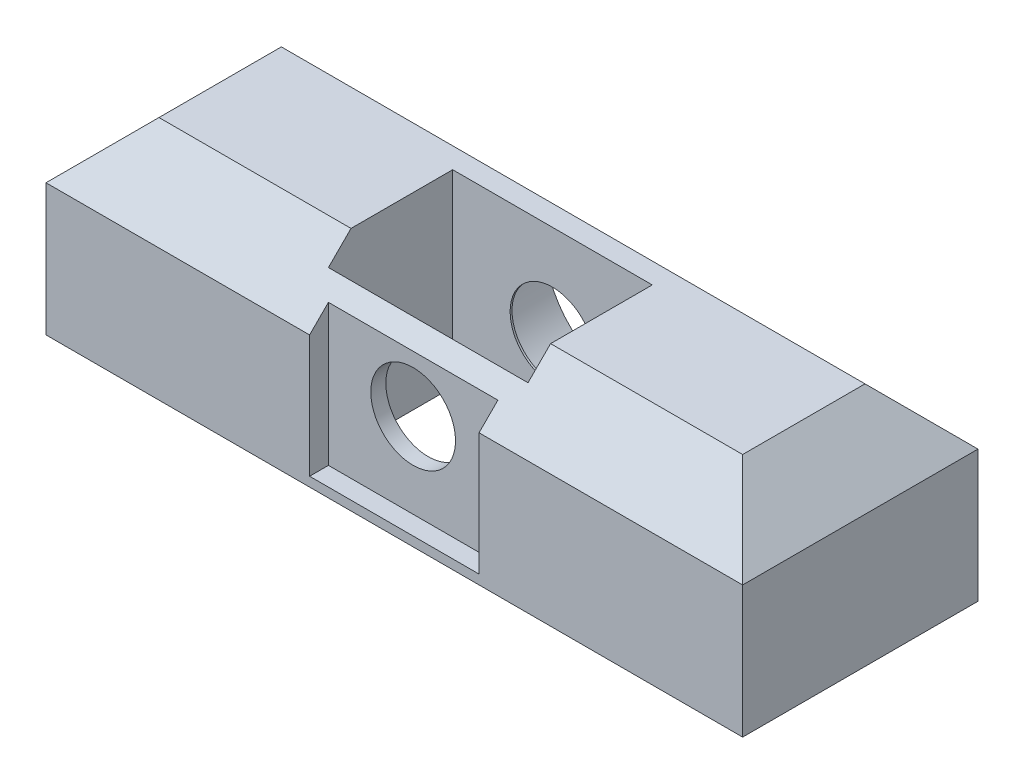
ISO-10303-21;
HEADER;
FILE_DESCRIPTION(('STEP AP214'),'2;1');
FILE_NAME('part.step','',(''),(''),'','','');
FILE_SCHEMA(('AUTOMOTIVE_DESIGN { 1 0 10303 214 1 1 1 1 }'));
ENDSEC;
DATA;
#1=APPLICATION_CONTEXT('core data for automotive mechanical design processes');
#2=APPLICATION_PROTOCOL_DEFINITION('international standard','automotive_design',2000,#1);
#3=PRODUCT_CONTEXT('',#1,'mechanical');
#4=PRODUCT('Part','Part','',(#3));
#5=PRODUCT_RELATED_PRODUCT_CATEGORY('part','',(#4));
#6=PRODUCT_DEFINITION_FORMATION('','',#4);
#7=PRODUCT_DEFINITION_CONTEXT('part definition',#1,'design');
#8=PRODUCT_DEFINITION('design','',#6,#7);
#9=PRODUCT_DEFINITION_SHAPE('','',#8);
#10=(LENGTH_UNIT() NAMED_UNIT(*) SI_UNIT(.MILLI.,.METRE.));
#11=(NAMED_UNIT(*) PLANE_ANGLE_UNIT() SI_UNIT($,.RADIAN.));
#12=(NAMED_UNIT(*) SI_UNIT($,.STERADIAN.) SOLID_ANGLE_UNIT());
#13=UNCERTAINTY_MEASURE_WITH_UNIT(LENGTH_MEASURE(1.E-05),#10,'distance_accuracy_value','');
#14=(GEOMETRIC_REPRESENTATION_CONTEXT(3) GLOBAL_UNCERTAINTY_ASSIGNED_CONTEXT((#13)) GLOBAL_UNIT_ASSIGNED_CONTEXT((#10,
#11,#12)) REPRESENTATION_CONTEXT('',''));
#15=CARTESIAN_POINT('',(0.,0.,0.));
#16=DIRECTION('',(0.,0.,1.));
#17=DIRECTION('',(1.,0.,0.));
#18=AXIS2_PLACEMENT_3D('',#15,#16,#17);
#19=CARTESIAN_POINT('',(0.,0.,12.5));
#20=DIRECTION('',(0.,0.,-1.));
#21=DIRECTION('',(-1.,0.,0.));
#22=AXIS2_PLACEMENT_3D('',#19,#20,#21);
#23=CYLINDRICAL_SURFACE('',#22,2.25);
#24=CARTESIAN_POINT('',(0.,0.,10.7));
#25=DIRECTION('',(0.,0.,1.));
#26=DIRECTION('',(1.,0.,0.));
#27=AXIS2_PLACEMENT_3D('',#24,#25,#26);
#28=CIRCLE('',#27,2.25);
#29=CARTESIAN_POINT('',(-2.25,0.,10.7));
#30=VERTEX_POINT('',#29);
#31=EDGE_CURVE('E200',#30,#30,#28,.T.);
#32=CARTESIAN_POINT('',(0.,0.,11.5));
#33=DIRECTION('',(0.,0.,1.));
#34=DIRECTION('',(1.,0.,0.));
#35=AXIS2_PLACEMENT_3D('',#32,#33,#34);
#36=CIRCLE('',#35,2.25);
#37=CARTESIAN_POINT('',(-2.25,0.,11.5));
#38=VERTEX_POINT('',#37);
#39=EDGE_CURVE('E242',#38,#38,#36,.T.);
#40=CARTESIAN_POINT('',(-2.25,0.,10.7));
#41=CARTESIAN_POINT('',(-2.25,0.,10.7083333333333));
#42=CARTESIAN_POINT('',(-2.25,0.,10.7166666666667));
#43=CARTESIAN_POINT('',(-2.25,0.,10.7333333333333));
#44=CARTESIAN_POINT('',(-2.25,0.,10.7416666666667));
#45=CARTESIAN_POINT('',(-2.25,0.,10.7583333333333));
#46=CARTESIAN_POINT('',(-2.25,0.,10.7666666666667));
#47=CARTESIAN_POINT('',(-2.25,0.,10.7833333333333));
#48=CARTESIAN_POINT('',(-2.25,0.,10.7916666666667));
#49=CARTESIAN_POINT('',(-2.25,0.,10.8083333333333));
#50=CARTESIAN_POINT('',(-2.25,0.,10.8166666666667));
#51=CARTESIAN_POINT('',(-2.25,0.,10.8333333333333));
#52=CARTESIAN_POINT('',(-2.25,0.,10.8416666666667));
#53=CARTESIAN_POINT('',(-2.25,0.,10.8583333333333));
#54=CARTESIAN_POINT('',(-2.25,0.,10.8666666666667));
#55=CARTESIAN_POINT('',(-2.25,0.,10.8833333333333));
#56=CARTESIAN_POINT('',(-2.25,0.,10.8916666666667));
#57=CARTESIAN_POINT('',(-2.25,0.,10.9083333333333));
#58=CARTESIAN_POINT('',(-2.25,0.,10.9166666666667));
#59=CARTESIAN_POINT('',(-2.25,0.,10.9333333333333));
#60=CARTESIAN_POINT('',(-2.25,0.,10.9416666666667));
#61=CARTESIAN_POINT('',(-2.25,0.,10.9583333333333));
#62=CARTESIAN_POINT('',(-2.25,0.,10.9666666666667));
#63=CARTESIAN_POINT('',(-2.25,0.,10.9833333333333));
#64=CARTESIAN_POINT('',(-2.25,0.,10.9916666666667));
#65=CARTESIAN_POINT('',(-2.25,0.,11.0083333333333));
#66=CARTESIAN_POINT('',(-2.25,0.,11.0166666666667));
#67=CARTESIAN_POINT('',(-2.25,0.,11.0333333333333));
#68=CARTESIAN_POINT('',(-2.25,0.,11.0416666666667));
#69=CARTESIAN_POINT('',(-2.25,0.,11.0583333333333));
#70=CARTESIAN_POINT('',(-2.25,0.,11.0666666666667));
#71=CARTESIAN_POINT('',(-2.25,0.,11.0833333333333));
#72=CARTESIAN_POINT('',(-2.25,0.,11.0916666666667));
#73=CARTESIAN_POINT('',(-2.25,0.,11.1083333333333));
#74=CARTESIAN_POINT('',(-2.25,0.,11.1166666666667));
#75=CARTESIAN_POINT('',(-2.25,0.,11.1333333333333));
#76=CARTESIAN_POINT('',(-2.25,0.,11.1416666666667));
#77=CARTESIAN_POINT('',(-2.25,0.,11.1583333333333));
#78=CARTESIAN_POINT('',(-2.25,0.,11.1666666666667));
#79=CARTESIAN_POINT('',(-2.25,0.,11.1833333333333));
#80=CARTESIAN_POINT('',(-2.25,0.,11.1916666666667));
#81=CARTESIAN_POINT('',(-2.25,0.,11.2083333333333));
#82=CARTESIAN_POINT('',(-2.25,0.,11.2166666666667));
#83=CARTESIAN_POINT('',(-2.25,0.,11.2333333333333));
#84=CARTESIAN_POINT('',(-2.25,0.,11.2416666666667));
#85=CARTESIAN_POINT('',(-2.25,0.,11.2583333333333));
#86=CARTESIAN_POINT('',(-2.25,0.,11.2666666666667));
#87=CARTESIAN_POINT('',(-2.25,0.,11.2833333333333));
#88=CARTESIAN_POINT('',(-2.25,0.,11.2916666666667));
#89=CARTESIAN_POINT('',(-2.25,0.,11.3083333333333));
#90=CARTESIAN_POINT('',(-2.25,0.,11.3166666666667));
#91=CARTESIAN_POINT('',(-2.25,0.,11.3333333333333));
#92=CARTESIAN_POINT('',(-2.25,0.,11.3416666666667));
#93=CARTESIAN_POINT('',(-2.25,0.,11.3583333333333));
#94=CARTESIAN_POINT('',(-2.25,0.,11.3666666666667));
#95=CARTESIAN_POINT('',(-2.25,0.,11.3833333333333));
#96=CARTESIAN_POINT('',(-2.25,0.,11.3916666666667));
#97=CARTESIAN_POINT('',(-2.25,0.,11.4083333333333));
#98=CARTESIAN_POINT('',(-2.25,0.,11.4166666666667));
#99=CARTESIAN_POINT('',(-2.25,0.,11.4333333333333));
#100=CARTESIAN_POINT('',(-2.25,0.,11.4416666666667));
#101=CARTESIAN_POINT('',(-2.25,0.,11.4583333333333));
#102=CARTESIAN_POINT('',(-2.25,0.,11.4666666666667));
#103=CARTESIAN_POINT('',(-2.25,0.,11.4833333333333));
#104=CARTESIAN_POINT('',(-2.25,0.,11.4916666666667));
#105=CARTESIAN_POINT('',(-2.25,0.,11.5));
#106=B_SPLINE_CURVE_WITH_KNOTS('',3,(#40,#41,#42,#43,#44,#45,#46,#47,#48,#49,#50,#51,#52,#53,
#54,#55,#56,#57,#58,#59,#60,#61,#62,#63,#64,#65,#66,#67,#68,#69,#70,#71,#72,#73,#74,#75,#76,#77,
#78,#79,#80,#81,#82,#83,#84,#85,#86,#87,#88,#89,#90,#91,#92,#93,#94,#95,#96,#97,#98,#99,#100,
#101,#102,#103,#104,#105),.UNSPECIFIED.,.F.,.F.,(4,2,2,2,2,2,2,2,2,2,2,2,2,2,2,2,2,2,2,2,2,2,2,
2,2,2,2,2,2,2,2,2,4),(0.,0.024999999999999,0.0499999999999997,0.0749999999999987,
0.0999999999999994,0.125,0.149999999999999,0.175,0.199999999999999,0.225,0.249999999999999,
0.274999999999999,0.3,0.324999999999999,0.35,0.374999999999999,0.399999999999999,0.425,
0.449999999999999,0.475,0.499999999999999,0.524999999999999,0.55,0.574999999999999,0.6,
0.624999999999999,0.65,0.674999999999998,0.699999999999999,0.725,0.749999999999999,0.775,
0.799999999999999),.UNSPECIFIED.);
#107=EDGE_CURVE('BSEAM47',#30,#38,#106,.T.);
#108=ORIENTED_EDGE('',*,*,#31,.F.);
#109=ORIENTED_EDGE('',*,*,#39,.T.);
#110=ORIENTED_EDGE('',*,*,#107,.T.);
#111=ORIENTED_EDGE('',*,*,#107,.F.);
#112=EDGE_LOOP('',(#108,#110,#109,#111));
#113=FACE_BOUND('',#112,.T.);
#114=ADVANCED_FACE('F47',(#113),#23,.F.);
#115=CARTESIAN_POINT('',(0.,0.,4.1));
#116=DIRECTION('',(0.,0.,-1.));
#117=DIRECTION('',(-1.,0.,0.));
#118=AXIS2_PLACEMENT_3D('',#115,#116,#117);
#119=CIRCLE('',#118,2.25);
#120=CARTESIAN_POINT('',(-2.25,0.,4.1));
#121=VERTEX_POINT('',#120);
#122=EDGE_CURVE('E210',#121,#121,#119,.T.);
#123=CARTESIAN_POINT('',(0.,0.,4.));
#124=DIRECTION('',(0.,0.,-1.));
#125=DIRECTION('',(-1.,0.,0.));
#126=AXIS2_PLACEMENT_3D('',#123,#124,#125);
#127=CIRCLE('',#126,2.25);
#128=CARTESIAN_POINT('',(-2.25,0.,4.));
#129=VERTEX_POINT('',#128);
#130=EDGE_CURVE('E250',#129,#129,#127,.T.);
#131=CARTESIAN_POINT('',(-2.25,0.,4.1));
#132=CARTESIAN_POINT('',(-2.25,0.,4.09895833333334));
#133=CARTESIAN_POINT('',(-2.25,0.,4.09791666666667));
#134=CARTESIAN_POINT('',(-2.25,0.,4.09583333333334));
#135=CARTESIAN_POINT('',(-2.25,0.,4.09479166666667));
#136=CARTESIAN_POINT('',(-2.25,0.,4.09270833333334));
#137=CARTESIAN_POINT('',(-2.25,0.,4.09166666666667));
#138=CARTESIAN_POINT('',(-2.25,0.,4.08958333333334));
#139=CARTESIAN_POINT('',(-2.25,0.,4.08854166666667));
#140=CARTESIAN_POINT('',(-2.25,0.,4.08645833333334));
#141=CARTESIAN_POINT('',(-2.25,0.,4.08541666666667));
#142=CARTESIAN_POINT('',(-2.25,0.,4.08333333333334));
#143=CARTESIAN_POINT('',(-2.25,0.,4.08229166666667));
#144=CARTESIAN_POINT('',(-2.25,0.,4.08020833333333));
#145=CARTESIAN_POINT('',(-2.25,0.,4.07916666666667));
#146=CARTESIAN_POINT('',(-2.25,0.,4.07708333333334));
#147=CARTESIAN_POINT('',(-2.25,0.,4.07604166666667));
#148=CARTESIAN_POINT('',(-2.25,0.,4.07395833333334));
#149=CARTESIAN_POINT('',(-2.25,0.,4.07291666666667));
#150=CARTESIAN_POINT('',(-2.25,0.,4.07083333333334));
#151=CARTESIAN_POINT('',(-2.25,0.,4.06979166666667));
#152=CARTESIAN_POINT('',(-2.25,0.,4.06770833333334));
#153=CARTESIAN_POINT('',(-2.25,0.,4.06666666666667));
#154=CARTESIAN_POINT('',(-2.25,0.,4.06458333333333));
#155=CARTESIAN_POINT('',(-2.25,0.,4.06354166666667));
#156=CARTESIAN_POINT('',(-2.25,0.,4.06145833333334));
#157=CARTESIAN_POINT('',(-2.25,0.,4.06041666666667));
#158=CARTESIAN_POINT('',(-2.25,0.,4.05833333333333));
#159=CARTESIAN_POINT('',(-2.25,0.,4.05729166666667));
#160=CARTESIAN_POINT('',(-2.25,0.,4.05520833333333));
#161=CARTESIAN_POINT('',(-2.25,0.,4.05416666666667));
#162=CARTESIAN_POINT('',(-2.25,0.,4.05208333333333));
#163=CARTESIAN_POINT('',(-2.25,0.,4.05104166666667));
#164=CARTESIAN_POINT('',(-2.25,0.,4.04895833333333));
#165=CARTESIAN_POINT('',(-2.25,0.,4.04791666666667));
#166=CARTESIAN_POINT('',(-2.25,0.,4.04583333333334));
#167=CARTESIAN_POINT('',(-2.25,0.,4.04479166666667));
#168=CARTESIAN_POINT('',(-2.25,0.,4.04270833333333));
#169=CARTESIAN_POINT('',(-2.25,0.,4.04166666666667));
#170=CARTESIAN_POINT('',(-2.25,0.,4.03958333333333));
#171=CARTESIAN_POINT('',(-2.25,0.,4.03854166666667));
#172=CARTESIAN_POINT('',(-2.25,0.,4.03645833333333));
#173=CARTESIAN_POINT('',(-2.25,0.,4.03541666666667));
#174=CARTESIAN_POINT('',(-2.25,0.,4.03333333333333));
#175=CARTESIAN_POINT('',(-2.25,0.,4.03229166666667));
#176=CARTESIAN_POINT('',(-2.25,0.,4.03020833333333));
#177=CARTESIAN_POINT('',(-2.25,0.,4.02916666666667));
#178=CARTESIAN_POINT('',(-2.25,0.,4.02708333333333));
#179=CARTESIAN_POINT('',(-2.25,0.,4.02604166666667));
#180=CARTESIAN_POINT('',(-2.25,0.,4.02395833333333));
#181=CARTESIAN_POINT('',(-2.25,0.,4.02291666666667));
#182=CARTESIAN_POINT('',(-2.25,0.,4.02083333333333));
#183=CARTESIAN_POINT('',(-2.25,0.,4.01979166666667));
#184=CARTESIAN_POINT('',(-2.25,0.,4.01770833333333));
#185=CARTESIAN_POINT('',(-2.25,0.,4.01666666666667));
#186=CARTESIAN_POINT('',(-2.25,0.,4.01458333333333));
#187=CARTESIAN_POINT('',(-2.25,0.,4.01354166666667));
#188=CARTESIAN_POINT('',(-2.25,0.,4.01145833333333));
#189=CARTESIAN_POINT('',(-2.25,0.,4.01041666666667));
#190=CARTESIAN_POINT('',(-2.25,0.,4.00833333333333));
#191=CARTESIAN_POINT('',(-2.25,0.,4.00729166666667));
#192=CARTESIAN_POINT('',(-2.25,0.,4.00520833333333));
#193=CARTESIAN_POINT('',(-2.25,0.,4.00416666666667));
#194=CARTESIAN_POINT('',(-2.25,0.,4.00208333333333));
#195=CARTESIAN_POINT('',(-2.25,0.,4.00104166666667));
#196=CARTESIAN_POINT('',(-2.25,0.,4.));
#197=B_SPLINE_CURVE_WITH_KNOTS('',3,(#131,#132,#133,#134,#135,#136,#137,#138,#139,#140,#141,
#142,#143,#144,#145,#146,#147,#148,#149,#150,#151,#152,#153,#154,#155,#156,#157,#158,#159,#160,
#161,#162,#163,#164,#165,#166,#167,#168,#169,#170,#171,#172,#173,#174,#175,#176,#177,#178,#179,
#180,#181,#182,#183,#184,#185,#186,#187,#188,#189,#190,#191,#192,#193,#194,#195,#196),
.UNSPECIFIED.,.F.,.F.,(4,2,2,2,2,2,2,2,2,2,2,2,2,2,2,2,2,2,2,2,2,2,2,2,2,2,2,2,2,2,2,2,4),(0.,
0.00312499999999966,0.00624999999999931,0.0093750000000007,0.0125000000000004,0.015625,
0.0187500000000014,0.0218750000000011,0.0250000000000007,0.0281250000000004,0.03125,
0.0343750000000014,0.0375000000000011,0.0406250000000007,0.0437500000000021,0.0468750000000018,
0.0500000000000014,0.0531250000000011,0.0562500000000007,0.0593750000000021,0.0625000000000018,
0.0656250000000014,0.0687500000000028,0.0718750000000025,0.0750000000000021,0.0781250000000018,
0.0812500000000015,0.0843750000000029,0.0875000000000025,0.0906250000000022,0.0937500000000036,
0.0968750000000032,0.100000000000003),.UNSPECIFIED.);
#198=EDGE_CURVE('BSEAM407',#121,#129,#197,.T.);
#199=ORIENTED_EDGE('',*,*,#122,.F.);
#200=ORIENTED_EDGE('',*,*,#130,.T.);
#201=ORIENTED_EDGE('',*,*,#198,.T.);
#202=ORIENTED_EDGE('',*,*,#198,.F.);
#203=EDGE_LOOP('',(#199,#201,#200,#202));
#204=FACE_BOUND('',#203,.T.);
#205=ADVANCED_FACE('F407',(#204),#23,.F.);
#206=CARTESIAN_POINT('',(18.5,5.,4.5));
#207=DIRECTION('',(-1.,0.,0.));
#208=DIRECTION('',(0.,-1.,0.));
#209=AXIS2_PLACEMENT_3D('',#206,#207,#208);
#210=PLANE('',#209);
#211=DIRECTION('',(0.,1.,0.));
#212=VECTOR('',#211,1.);
#213=CARTESIAN_POINT('',(18.5,5.,0.));
#214=LINE('',#213,#212);
#215=CARTESIAN_POINT('',(18.5,-5.,0.));
#216=VERTEX_POINT('',#215);
#217=CARTESIAN_POINT('',(18.5,1.99999999999995,0.));
#218=VERTEX_POINT('',#217);
#219=EDGE_CURVE('E266',#216,#218,#214,.T.);
#220=ORIENTED_EDGE('',*,*,#219,.T.);
#221=DIRECTION('',(0.,0.,1.));
#222=VECTOR('',#221,1.);
#223=CARTESIAN_POINT('',(18.5,1.99999999999995,4.5));
#224=LINE('',#223,#222);
#225=CARTESIAN_POINT('',(18.5,1.99999999999995,12.5));
#226=VERTEX_POINT('',#225);
#227=EDGE_CURVE('E307',#218,#226,#224,.T.);
#228=ORIENTED_EDGE('',*,*,#227,.T.);
#229=DIRECTION('',(0.,1.,0.));
#230=VECTOR('',#229,1.);
#231=CARTESIAN_POINT('',(18.5,5.,12.5));
#232=LINE('',#231,#230);
#233=CARTESIAN_POINT('',(18.5,-4.99999999999999,12.5));
#234=VERTEX_POINT('',#233);
#235=EDGE_CURVE('E255',#234,#226,#232,.T.);
#236=ORIENTED_EDGE('',*,*,#235,.F.);
#237=DIRECTION('',(0.,0.,-1.));
#238=VECTOR('',#237,1.);
#239=CARTESIAN_POINT('',(18.5,-5.,4.5));
#240=LINE('',#239,#238);
#241=EDGE_CURVE('E276',#234,#216,#240,.T.);
#242=ORIENTED_EDGE('',*,*,#241,.T.);
#243=EDGE_LOOP('',(#220,#228,#236,#242));
#244=FACE_BOUND('',#243,.T.);
#245=ADVANCED_FACE('F412',(#244),#210,.F.);
#246=CARTESIAN_POINT('',(-18.5,5.,4.5));
#247=DIRECTION('',(0.,-1.,0.));
#248=DIRECTION('',(0.,0.,-1.));
#249=AXIS2_PLACEMENT_3D('',#246,#247,#248);
#250=PLANE('',#249);
#251=DIRECTION('',(1.,0.,0.));
#252=VECTOR('',#251,1.);
#253=CARTESIAN_POINT('',(-18.5,5.,9.49999999999998));
#254=LINE('',#253,#252);
#255=CARTESIAN_POINT('',(-15.5,5.,9.49999999999998));
#256=VERTEX_POINT('',#255);
#257=CARTESIAN_POINT('',(-5.3,5.,9.49999999999998));
#258=VERTEX_POINT('',#257);
#259=EDGE_CURVE('E303',#256,#258,#254,.T.);
#260=ORIENTED_EDGE('',*,*,#259,.T.);
#261=DIRECTION('',(0.,0.,1.));
#262=VECTOR('',#261,1.);
#263=CARTESIAN_POINT('',(-5.3,5.,4.1));
#264=LINE('',#263,#262);
#265=CARTESIAN_POINT('',(-5.3,5.,4.1));
#266=VERTEX_POINT('',#265);
#267=EDGE_CURVE('E192',#266,#258,#264,.T.);
#268=ORIENTED_EDGE('',*,*,#267,.F.);
#269=DIRECTION('',(-1.,0.,0.));
#270=VECTOR('',#269,1.);
#271=CARTESIAN_POINT('',(-5.3,5.,4.1));
#272=LINE('',#271,#270);
#273=CARTESIAN_POINT('',(5.3,5.,4.1));
#274=VERTEX_POINT('',#273);
#275=EDGE_CURVE('E181',#274,#266,#272,.T.);
#276=ORIENTED_EDGE('',*,*,#275,.F.);
#277=DIRECTION('',(0.,0.,-1.));
#278=VECTOR('',#277,1.);
#279=CARTESIAN_POINT('',(5.3,5.,4.1));
#280=LINE('',#279,#278);
#281=CARTESIAN_POINT('',(5.3,5.,9.49999999999998));
#282=VERTEX_POINT('',#281);
#283=EDGE_CURVE('E185',#282,#274,#280,.T.);
#284=ORIENTED_EDGE('',*,*,#283,.F.);
#285=DIRECTION('',(1.,0.,0.));
#286=VECTOR('',#285,1.);
#287=CARTESIAN_POINT('',(-18.5,5.,9.49999999999998));
#288=LINE('',#287,#286);
#289=CARTESIAN_POINT('',(15.5,5.,9.49999999999998));
#290=VERTEX_POINT('',#289);
#291=EDGE_CURVE('E284',#282,#290,#288,.T.);
#292=ORIENTED_EDGE('',*,*,#291,.T.);
#293=DIRECTION('',(0.,0.,-1.));
#294=VECTOR('',#293,1.);
#295=CARTESIAN_POINT('',(15.5,5.,4.5));
#296=LINE('',#295,#294);
#297=CARTESIAN_POINT('',(15.5,5.,3.00000000000002));
#298=VERTEX_POINT('',#297);
#299=EDGE_CURVE('E293',#290,#298,#296,.T.);
#300=ORIENTED_EDGE('',*,*,#299,.T.);
#301=DIRECTION('',(-1.,0.,0.));
#302=VECTOR('',#301,1.);
#303=CARTESIAN_POINT('',(-18.5,5.,3.00000000000002));
#304=LINE('',#303,#302);
#305=CARTESIAN_POINT('',(-15.5,5.,3.00000000000002));
#306=VERTEX_POINT('',#305);
#307=EDGE_CURVE('E297',#298,#306,#304,.T.);
#308=ORIENTED_EDGE('',*,*,#307,.T.);
#309=DIRECTION('',(0.,0.,1.));
#310=VECTOR('',#309,1.);
#311=CARTESIAN_POINT('',(-15.5,5.,4.5));
#312=LINE('',#311,#310);
#313=EDGE_CURVE('E300',#306,#256,#312,.T.);
#314=ORIENTED_EDGE('',*,*,#313,.T.);
#315=EDGE_LOOP('',(#260,#268,#276,#284,#292,#300,#308,#314));
#316=FACE_BOUND('',#315,.T.);
#317=ADVANCED_FACE('F360',(#316),#250,.F.);
#318=CARTESIAN_POINT('',(-18.5,5.,4.5));
#319=DIRECTION('',(1.,0.,0.));
#320=DIRECTION('',(0.,1.,0.));
#321=AXIS2_PLACEMENT_3D('',#318,#319,#320);
#322=PLANE('',#321);
#323=DIRECTION('',(0.,-1.,0.));
#324=VECTOR('',#323,1.);
#325=CARTESIAN_POINT('',(-18.5,5.,12.5));
#326=LINE('',#325,#324);
#327=CARTESIAN_POINT('',(-18.5,1.99999999999995,12.5));
#328=VERTEX_POINT('',#327);
#329=CARTESIAN_POINT('',(-18.5,-5.,12.5));
#330=VERTEX_POINT('',#329);
#331=EDGE_CURVE('E259',#328,#330,#326,.T.);
#332=ORIENTED_EDGE('',*,*,#331,.F.);
#333=DIRECTION('',(0.,0.,-1.));
#334=VECTOR('',#333,1.);
#335=CARTESIAN_POINT('',(-18.5,1.99999999999995,4.5));
#336=LINE('',#335,#334);
#337=CARTESIAN_POINT('',(-18.5,1.99999999999995,0.));
#338=VERTEX_POINT('',#337);
#339=EDGE_CURVE('E320',#328,#338,#336,.T.);
#340=ORIENTED_EDGE('',*,*,#339,.T.);
#341=DIRECTION('',(0.,-1.,0.));
#342=VECTOR('',#341,1.);
#343=CARTESIAN_POINT('',(-18.5,5.,0.));
#344=LINE('',#343,#342);
#345=CARTESIAN_POINT('',(-18.5,-5.,0.));
#346=VERTEX_POINT('',#345);
#347=EDGE_CURVE('E270',#338,#346,#344,.T.);
#348=ORIENTED_EDGE('',*,*,#347,.T.);
#349=DIRECTION('',(0.,0.,-1.));
#350=VECTOR('',#349,1.);
#351=CARTESIAN_POINT('',(-18.5,-5.,4.5));
#352=LINE('',#351,#350);
#353=EDGE_CURVE('E280',#330,#346,#352,.T.);
#354=ORIENTED_EDGE('',*,*,#353,.F.);
#355=EDGE_LOOP('',(#332,#340,#348,#354));
#356=FACE_BOUND('',#355,.T.);
#357=ADVANCED_FACE('F421',(#356),#322,.F.);
#358=CARTESIAN_POINT('',(-18.5,-5.,4.5));
#359=DIRECTION('',(0.,1.,0.));
#360=DIRECTION('',(0.,0.,1.));
#361=AXIS2_PLACEMENT_3D('',#358,#359,#360);
#362=PLANE('',#361);
#363=DIRECTION('',(-1.,0.,0.));
#364=VECTOR('',#363,1.);
#365=CARTESIAN_POINT('',(-5.3,-5.,4.1));
#366=LINE('',#365,#364);
#367=CARTESIAN_POINT('',(5.3,-5.,4.1));
#368=VERTEX_POINT('',#367);
#369=CARTESIAN_POINT('',(-5.3,-5.,4.1));
#370=VERTEX_POINT('',#369);
#371=EDGE_CURVE('E169',#368,#370,#366,.T.);
#372=ORIENTED_EDGE('',*,*,#371,.T.);
#373=DIRECTION('',(0.,0.,1.));
#374=VECTOR('',#373,1.);
#375=CARTESIAN_POINT('',(-5.3,-5.,4.1));
#376=LINE('',#375,#374);
#377=CARTESIAN_POINT('',(-5.3,-5.,10.7));
#378=VERTEX_POINT('',#377);
#379=EDGE_CURVE('E163',#370,#378,#376,.T.);
#380=ORIENTED_EDGE('',*,*,#379,.T.);
#381=DIRECTION('',(1.,0.,0.));
#382=VECTOR('',#381,1.);
#383=CARTESIAN_POINT('',(-5.3,-5.,10.7));
#384=LINE('',#383,#382);
#385=CARTESIAN_POINT('',(5.3,-5.,10.7));
#386=VERTEX_POINT('',#385);
#387=EDGE_CURVE('E172',#378,#386,#384,.T.);
#388=ORIENTED_EDGE('',*,*,#387,.T.);
#389=DIRECTION('',(0.,0.,-1.));
#390=VECTOR('',#389,1.);
#391=CARTESIAN_POINT('',(5.3,-5.,4.1));
#392=LINE('',#391,#390);
#393=EDGE_CURVE('E64',#386,#368,#392,.T.);
#394=ORIENTED_EDGE('',*,*,#393,.T.);
#395=EDGE_LOOP('',(#372,#380,#388,#394));
#396=FACE_BOUND('',#395,.T.);
#397=DIRECTION('',(1.,0.,0.));
#398=VECTOR('',#397,1.);
#399=CARTESIAN_POINT('',(18.5,-4.99999999999999,12.5));
#400=LINE('',#399,#398);
#401=EDGE_CURVE('E262',#330,#234,#400,.T.);
#402=ORIENTED_EDGE('',*,*,#401,.F.);
#403=ORIENTED_EDGE('',*,*,#353,.T.);
#404=DIRECTION('',(1.,0.,0.));
#405=VECTOR('',#404,1.);
#406=CARTESIAN_POINT('',(-18.5,-5.,0.));
#407=LINE('',#406,#405);
#408=EDGE_CURVE('E273',#346,#216,#407,.T.);
#409=ORIENTED_EDGE('',*,*,#408,.T.);
#410=ORIENTED_EDGE('',*,*,#241,.F.);
#411=EDGE_LOOP('',(#402,#403,#409,#410));
#412=FACE_BOUND('',#411,.T.);
#413=ADVANCED_FACE('F177',(#396,#412),#362,.F.);
#414=CARTESIAN_POINT('',(0.,0.,0.));
#415=DIRECTION('',(0.,0.,1.));
#416=DIRECTION('',(1.,0.,0.));
#417=AXIS2_PLACEMENT_3D('',#414,#415,#416);
#418=PLANE('',#417);
#419=ORIENTED_EDGE('',*,*,#347,.F.);
#420=DIRECTION('',(1.,0.,0.));
#421=VECTOR('',#420,1.);
#422=CARTESIAN_POINT('',(0.,1.99999999999995,0.));
#423=LINE('',#422,#421);
#424=CARTESIAN_POINT('',(-4.0311288741493,1.99999999999995,0.));
#425=VERTEX_POINT('',#424);
#426=EDGE_CURVE('E314',#338,#425,#423,.T.);
#427=ORIENTED_EDGE('',*,*,#426,.T.);
#428=CARTESIAN_POINT('',(0.,0.,0.));
#429=DIRECTION('',(0.,0.,-1.));
#430=DIRECTION('',(-1.,0.,0.));
#431=AXIS2_PLACEMENT_3D('',#428,#429,#430);
#432=CIRCLE('',#431,4.5);
#433=CARTESIAN_POINT('',(4.0311288741493,1.99999999999995,0.));
#434=VERTEX_POINT('',#433);
#435=EDGE_CURVE('E251',#434,#425,#432,.T.);
#436=ORIENTED_EDGE('',*,*,#435,.F.);
#437=DIRECTION('',(1.,0.,0.));
#438=VECTOR('',#437,1.);
#439=CARTESIAN_POINT('',(0.,1.99999999999995,0.));
#440=LINE('',#439,#438);
#441=EDGE_CURVE('E311',#434,#218,#440,.T.);
#442=ORIENTED_EDGE('',*,*,#441,.T.);
#443=ORIENTED_EDGE('',*,*,#219,.F.);
#444=ORIENTED_EDGE('',*,*,#408,.F.);
#445=EDGE_LOOP('',(#419,#427,#436,#442,#443,#444));
#446=FACE_BOUND('',#445,.T.);
#447=ADVANCED_FACE('F386',(#446),#418,.F.);
#448=CARTESIAN_POINT('',(0.,0.,12.5));
#449=DIRECTION('',(0.,0.,-1.));
#450=DIRECTION('',(-1.,0.,0.));
#451=AXIS2_PLACEMENT_3D('',#448,#449,#450);
#452=PLANE('',#451);
#453=ORIENTED_EDGE('',*,*,#235,.T.);
#454=DIRECTION('',(-1.,0.,0.));
#455=VECTOR('',#454,1.);
#456=CARTESIAN_POINT('',(0.,1.99999999999995,12.5));
#457=LINE('',#456,#455);
#458=CARTESIAN_POINT('',(4.5,1.99999999999995,12.5));
#459=VERTEX_POINT('',#458);
#460=EDGE_CURVE('E326',#226,#459,#457,.T.);
#461=ORIENTED_EDGE('',*,*,#460,.T.);
#462=DIRECTION('',(0.,1.,0.));
#463=VECTOR('',#462,1.);
#464=CARTESIAN_POINT('',(4.5,4.5,12.5));
#465=LINE('',#464,#463);
#466=CARTESIAN_POINT('',(4.5,-4.5,12.5));
#467=VERTEX_POINT('',#466);
#468=EDGE_CURVE('E228',#467,#459,#465,.T.);
#469=ORIENTED_EDGE('',*,*,#468,.F.);
#470=DIRECTION('',(1.,0.,0.));
#471=VECTOR('',#470,1.);
#472=CARTESIAN_POINT('',(-4.5,-4.5,12.5));
#473=LINE('',#472,#471);
#474=CARTESIAN_POINT('',(-4.5,-4.5,12.5));
#475=VERTEX_POINT('',#474);
#476=EDGE_CURVE('E220',#475,#467,#473,.T.);
#477=ORIENTED_EDGE('',*,*,#476,.F.);
#478=DIRECTION('',(0.,-1.,0.));
#479=VECTOR('',#478,1.);
#480=CARTESIAN_POINT('',(-4.5,4.5,12.5));
#481=LINE('',#480,#479);
#482=CARTESIAN_POINT('',(-4.5,1.99999999999995,12.5));
#483=VERTEX_POINT('',#482);
#484=EDGE_CURVE('E232',#483,#475,#481,.T.);
#485=ORIENTED_EDGE('',*,*,#484,.F.);
#486=DIRECTION('',(-1.,0.,0.));
#487=VECTOR('',#486,1.);
#488=CARTESIAN_POINT('',(0.,1.99999999999995,12.5));
#489=LINE('',#488,#487);
#490=EDGE_CURVE('E323',#483,#328,#489,.T.);
#491=ORIENTED_EDGE('',*,*,#490,.T.);
#492=ORIENTED_EDGE('',*,*,#331,.T.);
#493=ORIENTED_EDGE('',*,*,#401,.T.);
#494=EDGE_LOOP('',(#453,#461,#469,#477,#485,#491,#492,#493));
#495=FACE_BOUND('',#494,.T.);
#496=ADVANCED_FACE('F392',(#495),#452,.F.);
#497=CARTESIAN_POINT('',(0.,0.,4.));
#498=DIRECTION('',(0.,0.,-1.));
#499=DIRECTION('',(-1.,0.,0.));
#500=AXIS2_PLACEMENT_3D('',#497,#498,#499);
#501=CYLINDRICAL_SURFACE('',#500,4.5);
#502=CARTESIAN_POINT('',(0.,0.,4.));
#503=DIRECTION('',(0.,0.,-1.));
#504=DIRECTION('',(-1.,0.,0.));
#505=AXIS2_PLACEMENT_3D('',#502,#503,#504);
#506=CIRCLE('',#505,4.5);
#507=CARTESIAN_POINT('',(-4.5,0.,4.));
#508=VERTEX_POINT('',#507);
#509=EDGE_CURVE('E246',#508,#508,#506,.T.);
#510=ORIENTED_EDGE('',*,*,#509,.F.);
#511=EDGE_LOOP('',(#510));
#512=FACE_BOUND('',#511,.T.);
#513=ORIENTED_EDGE('',*,*,#435,.T.);
#514=CARTESIAN_POINT('',(0.,0.,-1.99999999999993));
#515=DIRECTION('',(0.,-0.707106781186544,0.707106781186551));
#516=DIRECTION('',(0.,-0.707106781186551,-0.707106781186544));
#517=AXIS2_PLACEMENT_3D('',#514,#515,#516);
#518=ELLIPSE('',#517,6.36396103067889,4.5);
#519=EDGE_CURVE('E317',#425,#434,#518,.F.);
#520=ORIENTED_EDGE('',*,*,#519,.T.);
#521=EDGE_LOOP('',(#513,#520));
#522=FACE_BOUND('',#521,.T.);
#523=ADVANCED_FACE('F389',(#512,#522),#501,.F.);
#524=CARTESIAN_POINT('',(0.,0.,4.));
#525=DIRECTION('',(0.,0.,-1.));
#526=DIRECTION('',(-1.,0.,0.));
#527=AXIS2_PLACEMENT_3D('',#524,#525,#526);
#528=PLANE('',#527);
#529=ORIENTED_EDGE('',*,*,#130,.F.);
#530=EDGE_LOOP('',(#529));
#531=FACE_BOUND('',#530,.T.);
#532=ORIENTED_EDGE('',*,*,#509,.T.);
#533=EDGE_LOOP('',(#532));
#534=FACE_BOUND('',#533,.T.);
#535=ADVANCED_FACE('F391',(#531,#534),#528,.T.);
#536=CARTESIAN_POINT('',(4.5,4.5,11.5));
#537=DIRECTION('',(1.,0.,0.));
#538=DIRECTION('',(0.,0.,-1.));
#539=AXIS2_PLACEMENT_3D('',#536,#537,#538);
#540=PLANE('',#539);
#541=ORIENTED_EDGE('',*,*,#468,.T.);
#542=DIRECTION('',(0.,-0.707106781186551,0.707106781186544));
#543=VECTOR('',#542,1.);
#544=CARTESIAN_POINT('',(4.5,1.99999999999995,12.5));
#545=LINE('',#544,#543);
#546=CARTESIAN_POINT('',(4.5,2.99999999999996,11.5));
#547=VERTEX_POINT('',#546);
#548=EDGE_CURVE('E329',#459,#547,#545,.F.);
#549=ORIENTED_EDGE('',*,*,#548,.T.);
#550=DIRECTION('',(0.,1.,0.));
#551=VECTOR('',#550,1.);
#552=CARTESIAN_POINT('',(4.5,4.5,11.5));
#553=LINE('',#552,#551);
#554=CARTESIAN_POINT('',(4.5,-4.5,11.5));
#555=VERTEX_POINT('',#554);
#556=EDGE_CURVE('E215',#555,#547,#553,.T.);
#557=ORIENTED_EDGE('',*,*,#556,.F.);
#558=DIRECTION('',(0.,0.,1.));
#559=VECTOR('',#558,1.);
#560=CARTESIAN_POINT('',(4.5,-4.5,11.5));
#561=LINE('',#560,#559);
#562=EDGE_CURVE('E239',#555,#467,#561,.T.);
#563=ORIENTED_EDGE('',*,*,#562,.T.);
#564=EDGE_LOOP('',(#541,#549,#557,#563));
#565=FACE_BOUND('',#564,.T.);
#566=ADVANCED_FACE('F399',(#565),#540,.F.);
#567=CARTESIAN_POINT('',(-4.5,-4.5,11.5));
#568=DIRECTION('',(0.,-1.,0.));
#569=DIRECTION('',(0.,0.,-1.));
#570=AXIS2_PLACEMENT_3D('',#567,#568,#569);
#571=PLANE('',#570);
#572=ORIENTED_EDGE('',*,*,#476,.T.);
#573=ORIENTED_EDGE('',*,*,#562,.F.);
#574=DIRECTION('',(1.,0.,0.));
#575=VECTOR('',#574,1.);
#576=CARTESIAN_POINT('',(-4.5,-4.5,11.5));
#577=LINE('',#576,#575);
#578=CARTESIAN_POINT('',(-4.5,-4.5,11.5));
#579=VERTEX_POINT('',#578);
#580=EDGE_CURVE('E223',#579,#555,#577,.T.);
#581=ORIENTED_EDGE('',*,*,#580,.F.);
#582=DIRECTION('',(0.,0.,1.));
#583=VECTOR('',#582,1.);
#584=CARTESIAN_POINT('',(-4.5,-4.5,11.5));
#585=LINE('',#584,#583);
#586=EDGE_CURVE('E227',#579,#475,#585,.T.);
#587=ORIENTED_EDGE('',*,*,#586,.T.);
#588=EDGE_LOOP('',(#572,#573,#581,#587));
#589=FACE_BOUND('',#588,.T.);
#590=ADVANCED_FACE('F456',(#589),#571,.F.);
#591=CARTESIAN_POINT('',(-4.5,4.5,11.5));
#592=DIRECTION('',(-1.,0.,0.));
#593=DIRECTION('',(0.,-1.,0.));
#594=AXIS2_PLACEMENT_3D('',#591,#592,#593);
#595=PLANE('',#594);
#596=DIRECTION('',(0.,-1.,0.));
#597=VECTOR('',#596,1.);
#598=CARTESIAN_POINT('',(-4.5,4.5,11.5));
#599=LINE('',#598,#597);
#600=CARTESIAN_POINT('',(-4.5,2.99999999999996,11.5));
#601=VERTEX_POINT('',#600);
#602=EDGE_CURVE('E219',#601,#579,#599,.T.);
#603=ORIENTED_EDGE('',*,*,#602,.F.);
#604=DIRECTION('',(0.,0.707106781186551,-0.707106781186544));
#605=VECTOR('',#604,1.);
#606=CARTESIAN_POINT('',(-4.5,1.99999999999995,12.5));
#607=LINE('',#606,#605);
#608=EDGE_CURVE('E335',#601,#483,#607,.F.);
#609=ORIENTED_EDGE('',*,*,#608,.T.);
#610=ORIENTED_EDGE('',*,*,#484,.T.);
#611=ORIENTED_EDGE('',*,*,#586,.F.);
#612=EDGE_LOOP('',(#603,#609,#610,#611));
#613=FACE_BOUND('',#612,.T.);
#614=ADVANCED_FACE('F450',(#613),#595,.F.);
#615=CARTESIAN_POINT('',(0.,0.,11.5));
#616=DIRECTION('',(0.,0.,1.));
#617=DIRECTION('',(1.,0.,0.));
#618=AXIS2_PLACEMENT_3D('',#615,#616,#617);
#619=PLANE('',#618);
#620=ORIENTED_EDGE('',*,*,#39,.F.);
#621=EDGE_LOOP('',(#620));
#622=FACE_BOUND('',#621,.T.);
#623=ORIENTED_EDGE('',*,*,#556,.T.);
#624=DIRECTION('',(1.,0.,0.));
#625=VECTOR('',#624,1.);
#626=CARTESIAN_POINT('',(0.,2.99999999999996,11.5));
#627=LINE('',#626,#625);
#628=EDGE_CURVE('E332',#547,#601,#627,.F.);
#629=ORIENTED_EDGE('',*,*,#628,.T.);
#630=ORIENTED_EDGE('',*,*,#602,.T.);
#631=ORIENTED_EDGE('',*,*,#580,.T.);
#632=EDGE_LOOP('',(#623,#629,#630,#631));
#633=FACE_BOUND('',#632,.T.);
#634=ADVANCED_FACE('F446',(#622,#633),#619,.T.);
#635=CARTESIAN_POINT('',(-18.5,1.99999999999995,4.5));
#636=DIRECTION('',(0.707106781186551,-0.707106781186544,0.));
#637=DIRECTION('',(0.,0.,-1.));
#638=AXIS2_PLACEMENT_3D('',#635,#636,#637);
#639=PLANE('',#638);
#640=DIRECTION('',(-0.577350269189624,-0.57735026918963,-0.577350269189624));
#641=VECTOR('',#640,1.);
#642=CARTESIAN_POINT('',(-17.,3.49999999999995,1.49999999999999));
#643=LINE('',#642,#641);
#644=EDGE_CURVE('E344',#338,#306,#643,.F.);
#645=ORIENTED_EDGE('',*,*,#644,.F.);
#646=ORIENTED_EDGE('',*,*,#339,.F.);
#647=DIRECTION('',(-0.577350269189624,-0.57735026918963,0.577350269189624));
#648=VECTOR('',#647,1.);
#649=CARTESIAN_POINT('',(-12.3333333333334,8.16666666666663,6.33333333333338));
#650=LINE('',#649,#648);
#651=EDGE_CURVE('E233',#256,#328,#650,.T.);
#652=ORIENTED_EDGE('',*,*,#651,.F.);
#653=ORIENTED_EDGE('',*,*,#313,.F.);
#654=EDGE_LOOP('',(#645,#646,#652,#653));
#655=FACE_BOUND('',#654,.T.);
#656=ADVANCED_FACE('F50',(#655),#639,.F.);
#657=CARTESIAN_POINT('',(0.,1.99999999999995,12.5));
#658=DIRECTION('',(0.,-0.707106781186544,-0.707106781186551));
#659=DIRECTION('',(-1.,0.,0.));
#660=AXIS2_PLACEMENT_3D('',#657,#658,#659);
#661=PLANE('',#660);
#662=DIRECTION('',(0.,0.707106781186551,-0.707106781186544));
#663=VECTOR('',#662,1.);
#664=CARTESIAN_POINT('',(-5.3,1.99999999999995,12.5));
#665=LINE('',#664,#663);
#666=CARTESIAN_POINT('',(-5.3,3.79999999999997,10.7));
#667=VERTEX_POINT('',#666);
#668=EDGE_CURVE('E12',#258,#667,#665,.F.);
#669=ORIENTED_EDGE('',*,*,#668,.F.);
#670=ORIENTED_EDGE('',*,*,#259,.F.);
#671=ORIENTED_EDGE('',*,*,#651,.T.);
#672=ORIENTED_EDGE('',*,*,#490,.F.);
#673=ORIENTED_EDGE('',*,*,#608,.F.);
#674=ORIENTED_EDGE('',*,*,#628,.F.);
#675=ORIENTED_EDGE('',*,*,#548,.F.);
#676=ORIENTED_EDGE('',*,*,#460,.F.);
#677=DIRECTION('',(-0.577350269189624,0.57735026918963,-0.577350269189624));
#678=VECTOR('',#677,1.);
#679=CARTESIAN_POINT('',(12.3333333333334,8.16666666666664,6.33333333333337));
#680=LINE('',#679,#678);
#681=EDGE_CURVE('E341',#290,#226,#680,.F.);
#682=ORIENTED_EDGE('',*,*,#681,.F.);
#683=ORIENTED_EDGE('',*,*,#291,.F.);
#684=DIRECTION('',(0.,-0.707106781186551,0.707106781186544));
#685=VECTOR('',#684,1.);
#686=CARTESIAN_POINT('',(5.3,1.99999999999995,12.5));
#687=LINE('',#686,#685);
#688=CARTESIAN_POINT('',(5.3,3.79999999999997,10.7));
#689=VERTEX_POINT('',#688);
#690=EDGE_CURVE('E57',#689,#282,#687,.F.);
#691=ORIENTED_EDGE('',*,*,#690,.F.);
#692=DIRECTION('',(-1.,0.,0.));
#693=VECTOR('',#692,1.);
#694=CARTESIAN_POINT('',(0.,3.79999999999997,10.7));
#695=LINE('',#694,#693);
#696=EDGE_CURVE('E338',#667,#689,#695,.F.);
#697=ORIENTED_EDGE('',*,*,#696,.F.);
#698=EDGE_LOOP('',(#669,#670,#671,#672,#673,#674,#675,#676,#682,#683,#691,#697));
#699=FACE_BOUND('',#698,.T.);
#700=ADVANCED_FACE('F363',(#699),#661,.F.);
#701=CARTESIAN_POINT('',(-18.5,5.,3.00000000000002));
#702=DIRECTION('',(0.,-0.707106781186544,0.707106781186551));
#703=DIRECTION('',(-1.,0.,0.));
#704=AXIS2_PLACEMENT_3D('',#701,#702,#703);
#705=PLANE('',#704);
#706=ORIENTED_EDGE('',*,*,#644,.T.);
#707=ORIENTED_EDGE('',*,*,#307,.F.);
#708=DIRECTION('',(0.577350269189624,-0.57735026918963,-0.577350269189624));
#709=VECTOR('',#708,1.);
#710=CARTESIAN_POINT('',(4.16666666666672,16.3333333333334,14.3333333333333));
#711=LINE('',#710,#709);
#712=EDGE_CURVE('E214',#218,#298,#711,.F.);
#713=ORIENTED_EDGE('',*,*,#712,.F.);
#714=ORIENTED_EDGE('',*,*,#441,.F.);
#715=ORIENTED_EDGE('',*,*,#519,.F.);
#716=ORIENTED_EDGE('',*,*,#426,.F.);
#717=EDGE_LOOP('',(#706,#707,#713,#714,#715,#716));
#718=FACE_BOUND('',#717,.T.);
#719=ADVANCED_FACE('F380',(#718),#705,.F.);
#720=CARTESIAN_POINT('',(15.5,5.,4.5));
#721=DIRECTION('',(-0.707106781186551,-0.707106781186544,0.));
#722=DIRECTION('',(0.,0.,-1.));
#723=AXIS2_PLACEMENT_3D('',#720,#721,#722);
#724=PLANE('',#723);
#725=ORIENTED_EDGE('',*,*,#681,.T.);
#726=ORIENTED_EDGE('',*,*,#227,.F.);
#727=ORIENTED_EDGE('',*,*,#712,.T.);
#728=ORIENTED_EDGE('',*,*,#299,.F.);
#729=EDGE_LOOP('',(#725,#726,#727,#728));
#730=FACE_BOUND('',#729,.T.);
#731=ADVANCED_FACE('F369',(#730),#724,.F.);
#732=CARTESIAN_POINT('',(-5.3,-5.,4.1));
#733=DIRECTION('',(-1.,0.,0.));
#734=DIRECTION('',(0.,0.,1.));
#735=AXIS2_PLACEMENT_3D('',#732,#733,#734);
#736=PLANE('',#735);
#737=ORIENTED_EDGE('',*,*,#668,.T.);
#738=DIRECTION('',(0.,1.,0.));
#739=VECTOR('',#738,1.);
#740=CARTESIAN_POINT('',(-5.3,-5.,10.7));
#741=LINE('',#740,#739);
#742=EDGE_CURVE('E72',#378,#667,#741,.T.);
#743=ORIENTED_EDGE('',*,*,#742,.F.);
#744=ORIENTED_EDGE('',*,*,#379,.F.);
#745=DIRECTION('',(0.,1.,0.));
#746=VECTOR('',#745,1.);
#747=CARTESIAN_POINT('',(-5.3,-5.,4.1));
#748=LINE('',#747,#746);
#749=EDGE_CURVE('E197',#370,#266,#748,.T.);
#750=ORIENTED_EDGE('',*,*,#749,.T.);
#751=ORIENTED_EDGE('',*,*,#267,.T.);
#752=EDGE_LOOP('',(#737,#743,#744,#750,#751));
#753=FACE_BOUND('',#752,.T.);
#754=ADVANCED_FACE('F161',(#753),#736,.F.);
#755=CARTESIAN_POINT('',(-5.3,-5.,4.1));
#756=DIRECTION('',(0.,0.,-1.));
#757=DIRECTION('',(-1.,0.,0.));
#758=AXIS2_PLACEMENT_3D('',#755,#756,#757);
#759=PLANE('',#758);
#760=ORIENTED_EDGE('',*,*,#122,.T.);
#761=EDGE_LOOP('',(#760));
#762=FACE_BOUND('',#761,.T.);
#763=ORIENTED_EDGE('',*,*,#275,.T.);
#764=ORIENTED_EDGE('',*,*,#749,.F.);
#765=ORIENTED_EDGE('',*,*,#371,.F.);
#766=DIRECTION('',(0.,1.,0.));
#767=VECTOR('',#766,1.);
#768=CARTESIAN_POINT('',(5.3,-5.,4.1));
#769=LINE('',#768,#767);
#770=EDGE_CURVE('E201',#368,#274,#769,.T.);
#771=ORIENTED_EDGE('',*,*,#770,.T.);
#772=EDGE_LOOP('',(#763,#764,#765,#771));
#773=FACE_BOUND('',#772,.T.);
#774=ADVANCED_FACE('F483',(#762,#773),#759,.F.);
#775=CARTESIAN_POINT('',(5.3,-5.,4.1));
#776=DIRECTION('',(1.,0.,0.));
#777=DIRECTION('',(0.,0.,-1.));
#778=AXIS2_PLACEMENT_3D('',#775,#776,#777);
#779=PLANE('',#778);
#780=ORIENTED_EDGE('',*,*,#690,.T.);
#781=ORIENTED_EDGE('',*,*,#283,.T.);
#782=ORIENTED_EDGE('',*,*,#770,.F.);
#783=ORIENTED_EDGE('',*,*,#393,.F.);
#784=DIRECTION('',(0.,1.,0.));
#785=VECTOR('',#784,1.);
#786=CARTESIAN_POINT('',(5.3,-5.,10.7));
#787=LINE('',#786,#785);
#788=EDGE_CURVE('E168',#386,#689,#787,.T.);
#789=ORIENTED_EDGE('',*,*,#788,.T.);
#790=EDGE_LOOP('',(#780,#781,#782,#783,#789));
#791=FACE_BOUND('',#790,.T.);
#792=ADVANCED_FACE('F355',(#791),#779,.F.);
#793=CARTESIAN_POINT('',(-5.3,-5.,10.7));
#794=DIRECTION('',(0.,0.,1.));
#795=DIRECTION('',(1.,0.,0.));
#796=AXIS2_PLACEMENT_3D('',#793,#794,#795);
#797=PLANE('',#796);
#798=ORIENTED_EDGE('',*,*,#31,.T.);
#799=EDGE_LOOP('',(#798));
#800=FACE_BOUND('',#799,.T.);
#801=ORIENTED_EDGE('',*,*,#696,.T.);
#802=ORIENTED_EDGE('',*,*,#788,.F.);
#803=ORIENTED_EDGE('',*,*,#387,.F.);
#804=ORIENTED_EDGE('',*,*,#742,.T.);
#805=EDGE_LOOP('',(#801,#802,#803,#804));
#806=FACE_BOUND('',#805,.T.);
#807=ADVANCED_FACE('F173',(#800,#806),#797,.F.);
#808=CLOSED_SHELL('',(#114,#205,#245,#317,#357,#413,#447,#496,#523,#535,#566,#590,#614,#634,
#656,#700,#719,#731,#754,#774,#792,#807));
#809=MANIFOLD_SOLID_BREP('B2',#808);
#810=ADVANCED_BREP_SHAPE_REPRESENTATION('',(#18,#809),#14);
#811=SHAPE_DEFINITION_REPRESENTATION(#9,#810);
ENDSEC;
END-ISO-10303-21;
